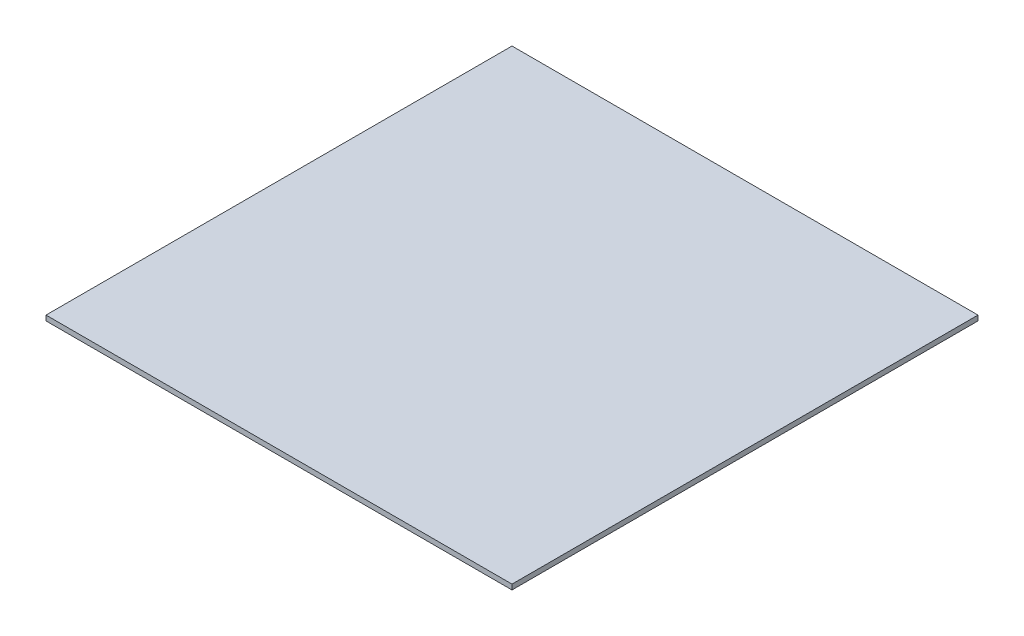
ISO-10303-21;
HEADER;
FILE_DESCRIPTION(('STEP AP214'),'2;1');
FILE_NAME('part.step','',(''),(''),'','','');
FILE_SCHEMA(('AUTOMOTIVE_DESIGN { 1 0 10303 214 1 1 1 1 }'));
ENDSEC;
DATA;
#1=APPLICATION_CONTEXT('core data for automotive mechanical design processes');
#2=APPLICATION_PROTOCOL_DEFINITION('international standard','automotive_design',2000,#1);
#3=PRODUCT_CONTEXT('',#1,'mechanical');
#4=PRODUCT('Part','Part','',(#3));
#5=PRODUCT_RELATED_PRODUCT_CATEGORY('part','',(#4));
#6=PRODUCT_DEFINITION_FORMATION('','',#4);
#7=PRODUCT_DEFINITION_CONTEXT('part definition',#1,'design');
#8=PRODUCT_DEFINITION('design','',#6,#7);
#9=PRODUCT_DEFINITION_SHAPE('','',#8);
#10=(LENGTH_UNIT() NAMED_UNIT(*) SI_UNIT(.MILLI.,.METRE.));
#11=(NAMED_UNIT(*) PLANE_ANGLE_UNIT() SI_UNIT($,.RADIAN.));
#12=(NAMED_UNIT(*) SI_UNIT($,.STERADIAN.) SOLID_ANGLE_UNIT());
#13=UNCERTAINTY_MEASURE_WITH_UNIT(LENGTH_MEASURE(1.E-05),#10,'distance_accuracy_value','');
#14=(GEOMETRIC_REPRESENTATION_CONTEXT(3) GLOBAL_UNCERTAINTY_ASSIGNED_CONTEXT((#13)) GLOBAL_UNIT_ASSIGNED_CONTEXT((#10,
#11,#12)) REPRESENTATION_CONTEXT('',''));
#15=CARTESIAN_POINT('',(0.,0.,0.));
#16=DIRECTION('',(0.,0.,1.));
#17=DIRECTION('',(1.,0.,0.));
#18=AXIS2_PLACEMENT_3D('',#15,#16,#17);
#19=CARTESIAN_POINT('',(-228.6,-5.,228.6));
#20=DIRECTION('',(-1.,0.,0.));
#21=DIRECTION('',(0.,0.,1.));
#22=AXIS2_PLACEMENT_3D('',#19,#20,#21);
#23=PLANE('',#22);
#24=DIRECTION('',(0.,0.,1.));
#25=VECTOR('',#24,1.);
#26=CARTESIAN_POINT('',(-228.6,0.,228.6));
#27=LINE('',#26,#25);
#28=CARTESIAN_POINT('',(-228.6,0.,-228.6));
#29=VERTEX_POINT('',#28);
#30=CARTESIAN_POINT('',(-228.6,0.,228.6));
#31=VERTEX_POINT('',#30);
#32=EDGE_CURVE('E96',#29,#31,#27,.T.);
#33=ORIENTED_EDGE('',*,*,#32,.F.);
#34=DIRECTION('',(0.,1.,0.));
#35=VECTOR('',#34,1.);
#36=CARTESIAN_POINT('',(-228.6,-5.,-228.6));
#37=LINE('',#36,#35);
#38=CARTESIAN_POINT('',(-228.6,-5.,-228.6));
#39=VERTEX_POINT('',#38);
#40=EDGE_CURVE('E11',#39,#29,#37,.T.);
#41=ORIENTED_EDGE('',*,*,#40,.F.);
#42=DIRECTION('',(0.,0.,1.));
#43=VECTOR('',#42,1.);
#44=CARTESIAN_POINT('',(-228.6,-5.,228.6));
#45=LINE('',#44,#43);
#46=CARTESIAN_POINT('',(-228.6,-5.,228.6));
#47=VERTEX_POINT('',#46);
#48=EDGE_CURVE('E90',#39,#47,#45,.T.);
#49=ORIENTED_EDGE('',*,*,#48,.T.);
#50=DIRECTION('',(0.,1.,0.));
#51=VECTOR('',#50,1.);
#52=CARTESIAN_POINT('',(-228.6,-5.,228.6));
#53=LINE('',#52,#51);
#54=EDGE_CURVE('E35',#47,#31,#53,.T.);
#55=ORIENTED_EDGE('',*,*,#54,.T.);
#56=EDGE_LOOP('',(#33,#41,#49,#55));
#57=FACE_BOUND('',#56,.T.);
#58=ADVANCED_FACE('F32',(#57),#23,.T.);
#59=CARTESIAN_POINT('',(-228.6,-5.,-228.6));
#60=DIRECTION('',(0.,0.,-1.));
#61=DIRECTION('',(-1.,0.,0.));
#62=AXIS2_PLACEMENT_3D('',#59,#60,#61);
#63=PLANE('',#62);
#64=DIRECTION('',(-1.,0.,0.));
#65=VECTOR('',#64,1.);
#66=CARTESIAN_POINT('',(-228.6,0.,-228.6));
#67=LINE('',#66,#65);
#68=CARTESIAN_POINT('',(228.6,0.,-228.6));
#69=VERTEX_POINT('',#68);
#70=EDGE_CURVE('E92',#69,#29,#67,.T.);
#71=ORIENTED_EDGE('',*,*,#70,.F.);
#72=DIRECTION('',(0.,1.,0.));
#73=VECTOR('',#72,1.);
#74=CARTESIAN_POINT('',(228.6,-5.,-228.6));
#75=LINE('',#74,#73);
#76=CARTESIAN_POINT('',(228.6,-5.,-228.6));
#77=VERTEX_POINT('',#76);
#78=EDGE_CURVE('E41',#77,#69,#75,.T.);
#79=ORIENTED_EDGE('',*,*,#78,.F.);
#80=DIRECTION('',(-1.,0.,0.));
#81=VECTOR('',#80,1.);
#82=CARTESIAN_POINT('',(-228.6,-5.,-228.6));
#83=LINE('',#82,#81);
#84=EDGE_CURVE('E87',#77,#39,#83,.T.);
#85=ORIENTED_EDGE('',*,*,#84,.T.);
#86=ORIENTED_EDGE('',*,*,#40,.T.);
#87=EDGE_LOOP('',(#71,#79,#85,#86));
#88=FACE_BOUND('',#87,.T.);
#89=ADVANCED_FACE('F106',(#88),#63,.T.);
#90=CARTESIAN_POINT('',(228.6,-5.,228.6));
#91=DIRECTION('',(1.,0.,0.));
#92=DIRECTION('',(0.,0.,-1.));
#93=AXIS2_PLACEMENT_3D('',#90,#91,#92);
#94=PLANE('',#93);
#95=DIRECTION('',(0.,0.,-1.));
#96=VECTOR('',#95,1.);
#97=CARTESIAN_POINT('',(228.6,0.,228.6));
#98=LINE('',#97,#96);
#99=CARTESIAN_POINT('',(228.6,0.,228.6));
#100=VERTEX_POINT('',#99);
#101=EDGE_CURVE('E82',#100,#69,#98,.T.);
#102=ORIENTED_EDGE('',*,*,#101,.F.);
#103=DIRECTION('',(0.,1.,0.));
#104=VECTOR('',#103,1.);
#105=CARTESIAN_POINT('',(228.6,-5.,228.6));
#106=LINE('',#105,#104);
#107=CARTESIAN_POINT('',(228.6,-5.,228.6));
#108=VERTEX_POINT('',#107);
#109=EDGE_CURVE('E77',#108,#100,#106,.T.);
#110=ORIENTED_EDGE('',*,*,#109,.F.);
#111=DIRECTION('',(0.,0.,-1.));
#112=VECTOR('',#111,1.);
#113=CARTESIAN_POINT('',(228.6,-5.,228.6));
#114=LINE('',#113,#112);
#115=EDGE_CURVE('E80',#108,#77,#114,.T.);
#116=ORIENTED_EDGE('',*,*,#115,.T.);
#117=ORIENTED_EDGE('',*,*,#78,.T.);
#118=EDGE_LOOP('',(#102,#110,#116,#117));
#119=FACE_BOUND('',#118,.T.);
#120=ADVANCED_FACE('F79',(#119),#94,.T.);
#121=CARTESIAN_POINT('',(-228.6,-5.,228.6));
#122=DIRECTION('',(0.,0.,1.));
#123=DIRECTION('',(1.,0.,0.));
#124=AXIS2_PLACEMENT_3D('',#121,#122,#123);
#125=PLANE('',#124);
#126=DIRECTION('',(1.,0.,0.));
#127=VECTOR('',#126,1.);
#128=CARTESIAN_POINT('',(-228.6,0.,228.6));
#129=LINE('',#128,#127);
#130=EDGE_CURVE('E99',#31,#100,#129,.T.);
#131=ORIENTED_EDGE('',*,*,#130,.F.);
#132=ORIENTED_EDGE('',*,*,#54,.F.);
#133=DIRECTION('',(1.,0.,0.));
#134=VECTOR('',#133,1.);
#135=CARTESIAN_POINT('',(-228.6,-5.,228.6));
#136=LINE('',#135,#134);
#137=EDGE_CURVE('E86',#47,#108,#136,.T.);
#138=ORIENTED_EDGE('',*,*,#137,.T.);
#139=ORIENTED_EDGE('',*,*,#109,.T.);
#140=EDGE_LOOP('',(#131,#132,#138,#139));
#141=FACE_BOUND('',#140,.T.);
#142=ADVANCED_FACE('F89',(#141),#125,.T.);
#143=CARTESIAN_POINT('',(-228.6,-5.,-228.6));
#144=DIRECTION('',(0.,-1.,0.));
#145=DIRECTION('',(0.,0.,-1.));
#146=AXIS2_PLACEMENT_3D('',#143,#144,#145);
#147=PLANE('',#146);
#148=ORIENTED_EDGE('',*,*,#48,.F.);
#149=ORIENTED_EDGE('',*,*,#84,.F.);
#150=ORIENTED_EDGE('',*,*,#115,.F.);
#151=ORIENTED_EDGE('',*,*,#137,.F.);
#152=EDGE_LOOP('',(#148,#149,#150,#151));
#153=FACE_BOUND('',#152,.T.);
#154=ADVANCED_FACE('F85',(#153),#147,.T.);
#155=CARTESIAN_POINT('',(-228.6,0.,-228.6));
#156=DIRECTION('',(0.,-1.,0.));
#157=DIRECTION('',(0.,0.,-1.));
#158=AXIS2_PLACEMENT_3D('',#155,#156,#157);
#159=PLANE('',#158);
#160=ORIENTED_EDGE('',*,*,#32,.T.);
#161=ORIENTED_EDGE('',*,*,#130,.T.);
#162=ORIENTED_EDGE('',*,*,#101,.T.);
#163=ORIENTED_EDGE('',*,*,#70,.T.);
#164=EDGE_LOOP('',(#160,#161,#162,#163));
#165=FACE_BOUND('',#164,.T.);
#166=ADVANCED_FACE('F105',(#165),#159,.F.);
#167=CLOSED_SHELL('',(#58,#89,#120,#142,#154,#166));
#168=MANIFOLD_SOLID_BREP('B2',#167);
#169=ADVANCED_BREP_SHAPE_REPRESENTATION('',(#18,#168),#14);
#170=SHAPE_DEFINITION_REPRESENTATION(#9,#169);
ENDSEC;
END-ISO-10303-21;
